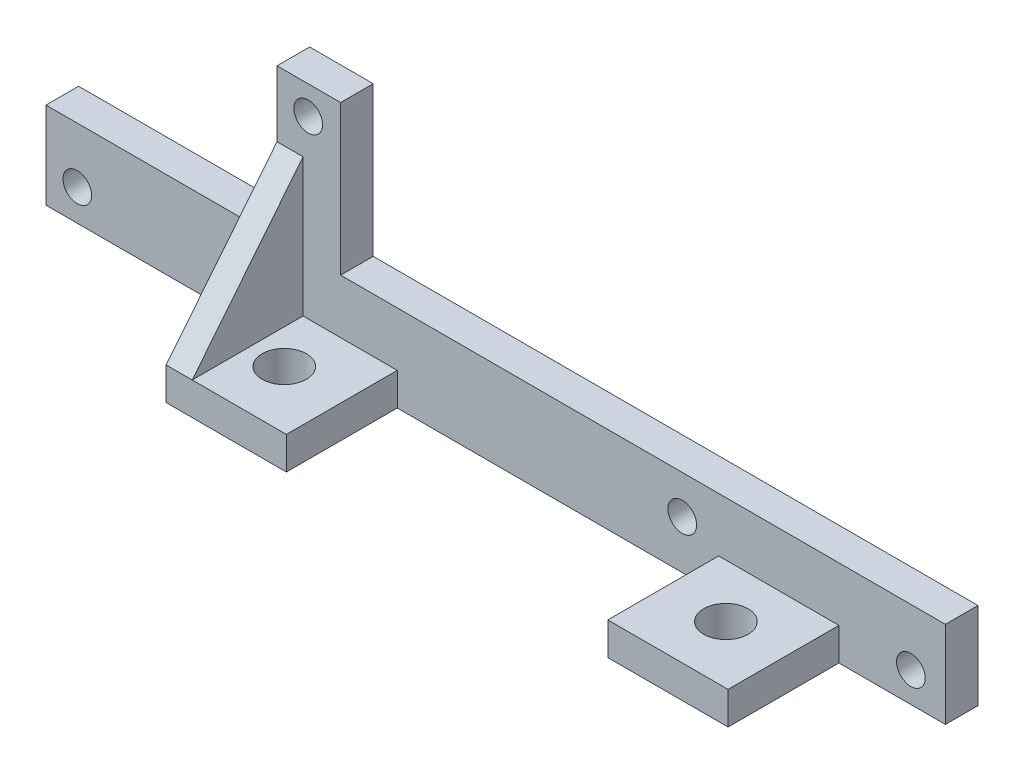
ISO-10303-21;
HEADER;
FILE_DESCRIPTION(('STEP AP214'),'2;1');
FILE_NAME('part.step','',(''),(''),'','','');
FILE_SCHEMA(('AUTOMOTIVE_DESIGN { 1 0 10303 214 1 1 1 1 }'));
ENDSEC;
DATA;
#1=APPLICATION_CONTEXT('core data for automotive mechanical design processes');
#2=APPLICATION_PROTOCOL_DEFINITION('international standard','automotive_design',2000,#1);
#3=PRODUCT_CONTEXT('',#1,'mechanical');
#4=PRODUCT('Part','Part','',(#3));
#5=PRODUCT_RELATED_PRODUCT_CATEGORY('part','',(#4));
#6=PRODUCT_DEFINITION_FORMATION('','',#4);
#7=PRODUCT_DEFINITION_CONTEXT('part definition',#1,'design');
#8=PRODUCT_DEFINITION('design','',#6,#7);
#9=PRODUCT_DEFINITION_SHAPE('','',#8);
#10=(LENGTH_UNIT() NAMED_UNIT(*) SI_UNIT(.MILLI.,.METRE.));
#11=(NAMED_UNIT(*) PLANE_ANGLE_UNIT() SI_UNIT($,.RADIAN.));
#12=(NAMED_UNIT(*) SI_UNIT($,.STERADIAN.) SOLID_ANGLE_UNIT());
#13=UNCERTAINTY_MEASURE_WITH_UNIT(LENGTH_MEASURE(1.E-05),#10,'distance_accuracy_value','');
#14=(GEOMETRIC_REPRESENTATION_CONTEXT(3) GLOBAL_UNCERTAINTY_ASSIGNED_CONTEXT((#13)) GLOBAL_UNIT_ASSIGNED_CONTEXT((#10,
#11,#12)) REPRESENTATION_CONTEXT('',''));
#15=CARTESIAN_POINT('',(0.,0.,0.));
#16=DIRECTION('',(0.,0.,1.));
#17=DIRECTION('',(1.,0.,0.));
#18=AXIS2_PLACEMENT_3D('',#15,#16,#17);
#19=CARTESIAN_POINT('',(0.,0.,0.));
#20=DIRECTION('',(0.,0.,-1.));
#21=DIRECTION('',(-1.,0.,0.));
#22=AXIS2_PLACEMENT_3D('',#19,#20,#21);
#23=PLANE('',#22);
#24=CARTESIAN_POINT('',(-39.952,-8.45200000000002,0.));
#25=DIRECTION('',(0.,0.,-1.));
#26=DIRECTION('',(-1.,0.,0.));
#27=AXIS2_PLACEMENT_3D('',#24,#25,#26);
#28=CIRCLE('',#27,1.397);
#29=CARTESIAN_POINT('',(-41.349,-8.45200000000002,0.));
#30=VERTEX_POINT('',#29);
#31=EDGE_CURVE('E227',#30,#30,#28,.T.);
#32=ORIENTED_EDGE('',*,*,#31,.T.);
#33=EDGE_LOOP('',(#32));
#34=FACE_BOUND('',#33,.T.);
#35=DIRECTION('',(0.,1.,0.));
#36=VECTOR('',#35,1.);
#37=CARTESIAN_POINT('',(-20.5101272468495,-39.3,0.));
#38=LINE('',#37,#36);
#39=CARTESIAN_POINT('',(-20.5101272468495,-11.5,0.));
#40=VERTEX_POINT('',#39);
#41=CARTESIAN_POINT('',(-20.5101272468495,-3.05620741999999,0.));
#42=VERTEX_POINT('',#41);
#43=EDGE_CURVE('E629',#40,#42,#38,.T.);
#44=ORIENTED_EDGE('',*,*,#43,.T.);
#45=DIRECTION('',(-1.,0.,0.));
#46=VECTOR('',#45,1.);
#47=CARTESIAN_POINT('',(-43.,-3.05620741999999,0.));
#48=LINE('',#47,#46);
#49=CARTESIAN_POINT('',(-43.,-3.05620741999999,0.));
#50=VERTEX_POINT('',#49);
#51=EDGE_CURVE('E186',#42,#50,#48,.T.);
#52=ORIENTED_EDGE('',*,*,#51,.T.);
#53=DIRECTION('',(0.,-1.,0.));
#54=VECTOR('',#53,1.);
#55=CARTESIAN_POINT('',(-43.,11.5,0.));
#56=LINE('',#55,#54);
#57=CARTESIAN_POINT('',(-43.,-11.5,0.));
#58=VERTEX_POINT('',#57);
#59=EDGE_CURVE('E296',#50,#58,#56,.T.);
#60=ORIENTED_EDGE('',*,*,#59,.T.);
#61=DIRECTION('',(1.,0.,0.));
#62=VECTOR('',#61,1.);
#63=CARTESIAN_POINT('',(-43.,-11.5,0.));
#64=LINE('',#63,#62);
#65=EDGE_CURVE('E301',#58,#40,#64,.T.);
#66=ORIENTED_EDGE('',*,*,#65,.T.);
#67=EDGE_LOOP('',(#44,#52,#60,#66));
#68=FACE_BOUND('',#67,.T.);
#69=ADVANCED_FACE('F39',(#34,#68),#23,.F.);
#70=CARTESIAN_POINT('',(0.,-8.325,0.));
#71=DIRECTION('',(0.,1.,0.));
#72=DIRECTION('',(0.,0.,1.));
#73=AXIS2_PLACEMENT_3D('',#70,#71,#72);
#74=PLANE('',#73);
#75=CARTESIAN_POINT('',(-14.6262602087204,-8.325,5.17743305211991));
#76=DIRECTION('',(0.,1.,0.));
#77=DIRECTION('',(0.,0.,1.));
#78=AXIS2_PLACEMENT_3D('',#75,#76,#77);
#79=CIRCLE('',#78,2.159);
#80=CARTESIAN_POINT('',(-14.6262602087204,-8.325,7.33643305211991));
#81=VERTEX_POINT('',#80);
#82=EDGE_CURVE('E251',#81,#81,#79,.T.);
#83=ORIENTED_EDGE('',*,*,#82,.F.);
#84=EDGE_LOOP('',(#83));
#85=FACE_BOUND('',#84,.T.);
#86=DIRECTION('',(1.,0.,0.));
#87=VECTOR('',#86,1.);
#88=CARTESIAN_POINT('',(-34.2000000105,-8.325,0.));
#89=LINE('',#88,#87);
#90=CARTESIAN_POINT('',(-17.9701272468495,-8.325,0.));
#91=VERTEX_POINT('',#90);
#92=CARTESIAN_POINT('',(-8.80000001050001,-8.325,0.));
#93=VERTEX_POINT('',#92);
#94=EDGE_CURVE('E275',#91,#93,#89,.T.);
#95=ORIENTED_EDGE('',*,*,#94,.F.);
#96=DIRECTION('',(0.,0.,1.));
#97=VECTOR('',#96,1.);
#98=CARTESIAN_POINT('',(-17.9701272468495,-8.325,0.));
#99=LINE('',#98,#97);
#100=CARTESIAN_POINT('',(-17.9701272468495,-8.325,10.795));
#101=VERTEX_POINT('',#100);
#102=EDGE_CURVE('E170',#91,#101,#99,.T.);
#103=ORIENTED_EDGE('',*,*,#102,.T.);
#104=DIRECTION('',(-1.,0.,0.));
#105=VECTOR('',#104,1.);
#106=CARTESIAN_POINT('',(-34.2000000105,-8.325,10.795));
#107=LINE('',#106,#105);
#108=CARTESIAN_POINT('',(-8.8000000105,-8.325,10.795));
#109=VERTEX_POINT('',#108);
#110=EDGE_CURVE('E281',#109,#101,#107,.T.);
#111=ORIENTED_EDGE('',*,*,#110,.F.);
#112=DIRECTION('',(0.,0.,1.));
#113=VECTOR('',#112,1.);
#114=CARTESIAN_POINT('',(-8.8000000105,-8.325,10.795));
#115=LINE('',#114,#113);
#116=EDGE_CURVE('E277',#93,#109,#115,.T.);
#117=ORIENTED_EDGE('',*,*,#116,.F.);
#118=EDGE_LOOP('',(#95,#103,#111,#117));
#119=FACE_BOUND('',#118,.T.);
#120=ADVANCED_FACE('F314',(#85,#119),#74,.T.);
#121=DIRECTION('',(0.,-1.,0.));
#122=VECTOR('',#121,1.);
#123=CARTESIAN_POINT('',(-20.5101272468495,11.5,0.));
#124=LINE('',#123,#122);
#125=CARTESIAN_POINT('',(-20.5101272468495,11.5,0.));
#126=VERTEX_POINT('',#125);
#127=CARTESIAN_POINT('',(-20.5101272468495,5.09978121447395,0.));
#128=VERTEX_POINT('',#127);
#129=EDGE_CURVE('E175',#126,#128,#124,.T.);
#130=ORIENTED_EDGE('',*,*,#129,.T.);
#131=DIRECTION('',(-1.,0.,0.));
#132=VECTOR('',#131,1.);
#133=CARTESIAN_POINT('',(0.,5.09978121447395,0.));
#134=LINE('',#133,#132);
#135=CARTESIAN_POINT('',(-17.9701272468495,5.09978121447395,0.));
#136=VERTEX_POINT('',#135);
#137=EDGE_CURVE('E160',#128,#136,#134,.F.);
#138=ORIENTED_EDGE('',*,*,#137,.T.);
#139=DIRECTION('',(0.,1.,0.));
#140=VECTOR('',#139,1.);
#141=CARTESIAN_POINT('',(-17.9701272468495,0.,0.));
#142=LINE('',#141,#140);
#143=EDGE_CURVE('E324',#91,#136,#142,.T.);
#144=ORIENTED_EDGE('',*,*,#143,.F.);
#145=ORIENTED_EDGE('',*,*,#94,.T.);
#146=DIRECTION('',(0.,-1.,0.));
#147=VECTOR('',#146,1.);
#148=CARTESIAN_POINT('',(-8.80000001050001,-8.325,0.));
#149=LINE('',#148,#147);
#150=CARTESIAN_POINT('',(-8.80000001050001,-11.5,0.));
#151=VERTEX_POINT('',#150);
#152=EDGE_CURVE('E284',#93,#151,#149,.T.);
#153=ORIENTED_EDGE('',*,*,#152,.T.);
#154=CARTESIAN_POINT('',(22.4898728085,-11.5,0.));
#155=VERTEX_POINT('',#154);
#156=EDGE_CURVE('E303',#151,#155,#64,.T.);
#157=ORIENTED_EDGE('',*,*,#156,.T.);
#158=DIRECTION('',(0.,1.,0.));
#159=VECTOR('',#158,1.);
#160=CARTESIAN_POINT('',(22.4898728085,-39.3,0.));
#161=LINE('',#160,#159);
#162=CARTESIAN_POINT('',(22.4898728085,-8.325,0.));
#163=VERTEX_POINT('',#162);
#164=EDGE_CURVE('E630',#155,#163,#161,.T.);
#165=ORIENTED_EDGE('',*,*,#164,.T.);
#166=DIRECTION('',(1.,0.,0.));
#167=VECTOR('',#166,1.);
#168=CARTESIAN_POINT('',(34.2000000105,-8.325,0.));
#169=LINE('',#168,#167);
#170=CARTESIAN_POINT('',(34.2000000105,-8.325,0.));
#171=VERTEX_POINT('',#170);
#172=EDGE_CURVE('E256',#163,#171,#169,.T.);
#173=ORIENTED_EDGE('',*,*,#172,.T.);
#174=DIRECTION('',(0.,-1.,0.));
#175=VECTOR('',#174,1.);
#176=CARTESIAN_POINT('',(34.2000000105,-8.325,0.));
#177=LINE('',#176,#175);
#178=CARTESIAN_POINT('',(34.2000000105,-11.5,0.));
#179=VERTEX_POINT('',#178);
#180=EDGE_CURVE('E265',#171,#179,#177,.T.);
#181=ORIENTED_EDGE('',*,*,#180,.T.);
#182=CARTESIAN_POINT('',(44.5635491781477,-11.5,0.));
#183=VERTEX_POINT('',#182);
#184=EDGE_CURVE('E290',#179,#183,#64,.T.);
#185=ORIENTED_EDGE('',*,*,#184,.T.);
#186=DIRECTION('',(0.,-1.,0.));
#187=VECTOR('',#186,1.);
#188=CARTESIAN_POINT('',(44.5635491781477,-11.5,0.));
#189=LINE('',#188,#187);
#190=CARTESIAN_POINT('',(44.5635491781477,-3.056207388,0.));
#191=VERTEX_POINT('',#190);
#192=EDGE_CURVE('E208',#191,#183,#189,.T.);
#193=ORIENTED_EDGE('',*,*,#192,.F.);
#194=DIRECTION('',(1.,0.,0.));
#195=VECTOR('',#194,1.);
#196=CARTESIAN_POINT('',(43.,-3.056207388,0.));
#197=LINE('',#196,#195);
#198=CARTESIAN_POINT('',(-14.3155277433446,-3.05620741999999,0.));
#199=VERTEX_POINT('',#198);
#200=EDGE_CURVE('E206',#199,#191,#197,.T.);
#201=ORIENTED_EDGE('',*,*,#200,.F.);
#202=DIRECTION('',(0.,1.,0.));
#203=VECTOR('',#202,1.);
#204=CARTESIAN_POINT('',(-14.3155277433446,11.5,0.));
#205=LINE('',#204,#203);
#206=CARTESIAN_POINT('',(-14.3155277433446,11.5,0.));
#207=VERTEX_POINT('',#206);
#208=EDGE_CURVE('E357',#199,#207,#205,.T.);
#209=ORIENTED_EDGE('',*,*,#208,.T.);
#210=DIRECTION('',(1.,0.,0.));
#211=VECTOR('',#210,1.);
#212=CARTESIAN_POINT('',(-43.,11.5,0.));
#213=LINE('',#212,#211);
#214=EDGE_CURVE('E185',#126,#207,#213,.T.);
#215=ORIENTED_EDGE('',*,*,#214,.F.);
#216=EDGE_LOOP('',(#130,#138,#144,#145,#153,#157,#165,#173,#181,#185,#193,#201,#209,#215));
#217=FACE_BOUND('',#216,.T.);
#218=CARTESIAN_POINT('',(41.206,-8.57899999999998,0.));
#219=DIRECTION('',(0.,0.,-1.));
#220=DIRECTION('',(-1.,0.,0.));
#221=AXIS2_PLACEMENT_3D('',#218,#219,#220);
#222=CIRCLE('',#221,1.397);
#223=CARTESIAN_POINT('',(39.809,-8.57899999999998,0.));
#224=VERTEX_POINT('',#223);
#225=EDGE_CURVE('E244',#224,#224,#222,.T.);
#226=ORIENTED_EDGE('',*,*,#225,.T.);
#227=EDGE_LOOP('',(#226));
#228=FACE_BOUND('',#227,.T.);
#229=CARTESIAN_POINT('',(-17.473,8.74379999999999,0.));
#230=DIRECTION('',(0.,0.,-1.));
#231=DIRECTION('',(-1.,0.,0.));
#232=AXIS2_PLACEMENT_3D('',#229,#230,#231);
#233=CIRCLE('',#232,1.397);
#234=CARTESIAN_POINT('',(-18.87,8.74379999999999,0.));
#235=VERTEX_POINT('',#234);
#236=EDGE_CURVE('E238',#235,#235,#233,.T.);
#237=ORIENTED_EDGE('',*,*,#236,.T.);
#238=EDGE_LOOP('',(#237));
#239=FACE_BOUND('',#238,.T.);
#240=CARTESIAN_POINT('',(18.9429,-6.80099999999999,0.));
#241=DIRECTION('',(0.,0.,-1.));
#242=DIRECTION('',(-1.,0.,0.));
#243=AXIS2_PLACEMENT_3D('',#240,#241,#242);
#244=CIRCLE('',#243,1.397);
#245=CARTESIAN_POINT('',(17.5459,-6.80099999999999,0.));
#246=VERTEX_POINT('',#245);
#247=EDGE_CURVE('E241',#246,#246,#244,.T.);
#248=ORIENTED_EDGE('',*,*,#247,.T.);
#249=EDGE_LOOP('',(#248));
#250=FACE_BOUND('',#249,.T.);
#251=ADVANCED_FACE('F181',(#217,#228,#239,#250),#23,.F.);
#252=CARTESIAN_POINT('',(-43.,-11.5,-3.175));
#253=DIRECTION('',(0.,-1.,0.));
#254=DIRECTION('',(0.,0.,-1.));
#255=AXIS2_PLACEMENT_3D('',#252,#253,#254);
#256=PLANE('',#255);
#257=DIRECTION('',(1.,0.,0.));
#258=VECTOR('',#257,1.);
#259=CARTESIAN_POINT('',(-43.,-11.5,-3.175));
#260=LINE('',#259,#258);
#261=CARTESIAN_POINT('',(-43.,-11.5,-3.175));
#262=VERTEX_POINT('',#261);
#263=CARTESIAN_POINT('',(44.5635491781477,-11.5,-3.175));
#264=VERTEX_POINT('',#263);
#265=EDGE_CURVE('E293',#262,#264,#260,.T.);
#266=ORIENTED_EDGE('',*,*,#265,.T.);
#267=DIRECTION('',(0.,0.,-1.));
#268=VECTOR('',#267,1.);
#269=CARTESIAN_POINT('',(44.5635491781477,-11.5,0.));
#270=LINE('',#269,#268);
#271=EDGE_CURVE('E219',#183,#264,#270,.T.);
#272=ORIENTED_EDGE('',*,*,#271,.F.);
#273=ORIENTED_EDGE('',*,*,#184,.F.);
#274=DIRECTION('',(0.,0.,1.));
#275=VECTOR('',#274,1.);
#276=CARTESIAN_POINT('',(34.2000000105,-11.5,0.));
#277=LINE('',#276,#275);
#278=CARTESIAN_POINT('',(34.2000000105,-11.5,10.795));
#279=VERTEX_POINT('',#278);
#280=EDGE_CURVE('E255',#179,#279,#277,.T.);
#281=ORIENTED_EDGE('',*,*,#280,.T.);
#282=DIRECTION('',(-1.,0.,0.));
#283=VECTOR('',#282,1.);
#284=CARTESIAN_POINT('',(34.2000000105,-11.5,10.795));
#285=LINE('',#284,#283);
#286=CARTESIAN_POINT('',(22.4898728085,-11.5,10.795));
#287=VERTEX_POINT('',#286);
#288=EDGE_CURVE('E259',#279,#287,#285,.T.);
#289=ORIENTED_EDGE('',*,*,#288,.T.);
#290=DIRECTION('',(0.,0.,1.));
#291=VECTOR('',#290,1.);
#292=CARTESIAN_POINT('',(22.4898728085,-11.5,-3.175));
#293=LINE('',#292,#291);
#294=EDGE_CURVE('E332',#155,#287,#293,.T.);
#295=ORIENTED_EDGE('',*,*,#294,.F.);
#296=ORIENTED_EDGE('',*,*,#156,.F.);
#297=DIRECTION('',(0.,0.,1.));
#298=VECTOR('',#297,1.);
#299=CARTESIAN_POINT('',(-8.8000000105,-11.5,10.795));
#300=LINE('',#299,#298);
#301=CARTESIAN_POINT('',(-8.8000000105,-11.5,10.795));
#302=VERTEX_POINT('',#301);
#303=EDGE_CURVE('E272',#151,#302,#300,.T.);
#304=ORIENTED_EDGE('',*,*,#303,.T.);
#305=DIRECTION('',(-1.,0.,0.));
#306=VECTOR('',#305,1.);
#307=CARTESIAN_POINT('',(-34.2000000105,-11.5,10.795));
#308=LINE('',#307,#306);
#309=CARTESIAN_POINT('',(-20.5101272468495,-11.5,10.795));
#310=VERTEX_POINT('',#309);
#311=EDGE_CURVE('E278',#302,#310,#308,.T.);
#312=ORIENTED_EDGE('',*,*,#311,.T.);
#313=DIRECTION('',(0.,0.,1.));
#314=VECTOR('',#313,1.);
#315=CARTESIAN_POINT('',(-20.5101272468495,-11.5,-3.175));
#316=LINE('',#315,#314);
#317=EDGE_CURVE('E196',#40,#310,#316,.T.);
#318=ORIENTED_EDGE('',*,*,#317,.F.);
#319=ORIENTED_EDGE('',*,*,#65,.F.);
#320=DIRECTION('',(0.,0.,1.));
#321=VECTOR('',#320,1.);
#322=CARTESIAN_POINT('',(-43.,-11.5,-3.175));
#323=LINE('',#322,#321);
#324=EDGE_CURVE('E47',#262,#58,#323,.T.);
#325=ORIENTED_EDGE('',*,*,#324,.F.);
#326=EDGE_LOOP('',(#266,#272,#273,#281,#289,#295,#296,#304,#312,#318,#319,#325));
#327=FACE_BOUND('',#326,.T.);
#328=CARTESIAN_POINT('',(-14.6262602087204,-11.5,5.17743305211991));
#329=DIRECTION('',(0.,-1.,0.));
#330=DIRECTION('',(0.,0.,-1.));
#331=AXIS2_PLACEMENT_3D('',#328,#329,#330);
#332=CIRCLE('',#331,2.159);
#333=CARTESIAN_POINT('',(-14.6262602087204,-11.5,3.01843305211991));
#334=VERTEX_POINT('',#333);
#335=EDGE_CURVE('E252',#334,#334,#332,.T.);
#336=ORIENTED_EDGE('',*,*,#335,.F.);
#337=EDGE_LOOP('',(#336));
#338=FACE_BOUND('',#337,.T.);
#339=CARTESIAN_POINT('',(28.3737398122796,-11.5,5.17743305211991));
#340=DIRECTION('',(0.,-1.,0.));
#341=DIRECTION('',(0.,0.,-1.));
#342=AXIS2_PLACEMENT_3D('',#339,#340,#341);
#343=CIRCLE('',#342,2.159);
#344=CARTESIAN_POINT('',(28.3737398122796,-11.5,3.01843305211991));
#345=VERTEX_POINT('',#344);
#346=EDGE_CURVE('E248',#345,#345,#343,.T.);
#347=ORIENTED_EDGE('',*,*,#346,.F.);
#348=EDGE_LOOP('',(#347));
#349=FACE_BOUND('',#348,.T.);
#350=ADVANCED_FACE('F41',(#327,#338,#349),#256,.T.);
#351=CARTESIAN_POINT('',(-43.,11.5,-3.175));
#352=DIRECTION('',(-1.,0.,0.));
#353=DIRECTION('',(0.,-1.,0.));
#354=AXIS2_PLACEMENT_3D('',#351,#352,#353);
#355=PLANE('',#354);
#356=DIRECTION('',(0.,0.,-1.));
#357=VECTOR('',#356,1.);
#358=CARTESIAN_POINT('',(-43.,-3.05620741999999,0.));
#359=LINE('',#358,#357);
#360=CARTESIAN_POINT('',(-43.,-3.05620741999999,-3.175));
#361=VERTEX_POINT('',#360);
#362=EDGE_CURVE('E198',#50,#361,#359,.T.);
#363=ORIENTED_EDGE('',*,*,#362,.T.);
#364=DIRECTION('',(0.,-1.,0.));
#365=VECTOR('',#364,1.);
#366=CARTESIAN_POINT('',(-43.,11.5,-3.175));
#367=LINE('',#366,#365);
#368=EDGE_CURVE('E299',#361,#262,#367,.T.);
#369=ORIENTED_EDGE('',*,*,#368,.T.);
#370=ORIENTED_EDGE('',*,*,#324,.T.);
#371=ORIENTED_EDGE('',*,*,#59,.F.);
#372=EDGE_LOOP('',(#363,#369,#370,#371));
#373=FACE_BOUND('',#372,.T.);
#374=ADVANCED_FACE('F366',(#373),#355,.T.);
#375=CARTESIAN_POINT('',(-43.,11.5,-3.175));
#376=DIRECTION('',(0.,-1.,0.));
#377=DIRECTION('',(0.,0.,-1.));
#378=AXIS2_PLACEMENT_3D('',#375,#376,#377);
#379=PLANE('',#378);
#380=ORIENTED_EDGE('',*,*,#214,.T.);
#381=DIRECTION('',(0.,0.,-1.));
#382=VECTOR('',#381,1.);
#383=CARTESIAN_POINT('',(-14.3155277433446,11.5,0.));
#384=LINE('',#383,#382);
#385=CARTESIAN_POINT('',(-14.3155277433446,11.5,-3.175));
#386=VERTEX_POINT('',#385);
#387=EDGE_CURVE('E216',#207,#386,#384,.T.);
#388=ORIENTED_EDGE('',*,*,#387,.T.);
#389=DIRECTION('',(1.,0.,0.));
#390=VECTOR('',#389,1.);
#391=CARTESIAN_POINT('',(-43.,11.5,-3.175));
#392=LINE('',#391,#390);
#393=CARTESIAN_POINT('',(-20.5101272468495,11.5,-3.175));
#394=VERTEX_POINT('',#393);
#395=EDGE_CURVE('E295',#394,#386,#392,.T.);
#396=ORIENTED_EDGE('',*,*,#395,.F.);
#397=DIRECTION('',(0.,0.,-1.));
#398=VECTOR('',#397,1.);
#399=CARTESIAN_POINT('',(-20.5101272468495,11.5,0.));
#400=LINE('',#399,#398);
#401=EDGE_CURVE('E61',#126,#394,#400,.T.);
#402=ORIENTED_EDGE('',*,*,#401,.F.);
#403=EDGE_LOOP('',(#380,#388,#396,#402));
#404=FACE_BOUND('',#403,.T.);
#405=ADVANCED_FACE('F364',(#404),#379,.F.);
#406=CARTESIAN_POINT('',(0.,0.,-3.175));
#407=DIRECTION('',(0.,0.,-1.));
#408=DIRECTION('',(-1.,0.,0.));
#409=AXIS2_PLACEMENT_3D('',#406,#407,#408);
#410=PLANE('',#409);
#411=CARTESIAN_POINT('',(-17.473,8.74379999999999,-3.175));
#412=DIRECTION('',(0.,0.,-1.));
#413=DIRECTION('',(1.,0.,0.));
#414=AXIS2_PLACEMENT_3D('',#411,#412,#413);
#415=CIRCLE('',#414,1.397);
#416=CARTESIAN_POINT('',(-16.076,8.74379999999999,-3.175));
#417=VERTEX_POINT('',#416);
#418=EDGE_CURVE('E231',#417,#417,#415,.T.);
#419=ORIENTED_EDGE('',*,*,#418,.F.);
#420=EDGE_LOOP('',(#419));
#421=FACE_BOUND('',#420,.T.);
#422=DIRECTION('',(-1.,0.,0.));
#423=VECTOR('',#422,1.);
#424=CARTESIAN_POINT('',(-43.,-3.05620741999999,-3.175));
#425=LINE('',#424,#423);
#426=CARTESIAN_POINT('',(-20.5101272468495,-3.05620741999999,-3.175));
#427=VERTEX_POINT('',#426);
#428=EDGE_CURVE('E187',#427,#361,#425,.T.);
#429=ORIENTED_EDGE('',*,*,#428,.F.);
#430=DIRECTION('',(0.,-1.,0.));
#431=VECTOR('',#430,1.);
#432=CARTESIAN_POINT('',(-20.5101272468495,11.5,-3.175));
#433=LINE('',#432,#431);
#434=EDGE_CURVE('E190',#394,#427,#433,.T.);
#435=ORIENTED_EDGE('',*,*,#434,.F.);
#436=ORIENTED_EDGE('',*,*,#395,.T.);
#437=DIRECTION('',(0.,1.,0.));
#438=VECTOR('',#437,1.);
#439=CARTESIAN_POINT('',(-14.3155277433446,11.5,-3.175));
#440=LINE('',#439,#438);
#441=CARTESIAN_POINT('',(-14.3155277433446,-3.05620741999999,-3.175));
#442=VERTEX_POINT('',#441);
#443=EDGE_CURVE('E201',#442,#386,#440,.T.);
#444=ORIENTED_EDGE('',*,*,#443,.F.);
#445=DIRECTION('',(1.,0.,0.));
#446=VECTOR('',#445,1.);
#447=CARTESIAN_POINT('',(43.,-3.056207388,-3.175));
#448=LINE('',#447,#446);
#449=CARTESIAN_POINT('',(44.5635491781477,-3.056207388,-3.175));
#450=VERTEX_POINT('',#449);
#451=EDGE_CURVE('E213',#442,#450,#448,.T.);
#452=ORIENTED_EDGE('',*,*,#451,.T.);
#453=DIRECTION('',(0.,-1.,0.));
#454=VECTOR('',#453,1.);
#455=CARTESIAN_POINT('',(44.5635491781477,-11.5,-3.175));
#456=LINE('',#455,#454);
#457=EDGE_CURVE('E209',#450,#264,#456,.T.);
#458=ORIENTED_EDGE('',*,*,#457,.T.);
#459=ORIENTED_EDGE('',*,*,#265,.F.);
#460=ORIENTED_EDGE('',*,*,#368,.F.);
#461=EDGE_LOOP('',(#429,#435,#436,#444,#452,#458,#459,#460));
#462=FACE_BOUND('',#461,.T.);
#463=CARTESIAN_POINT('',(-39.952,-8.45200000000002,-3.175));
#464=DIRECTION('',(0.,0.,-1.));
#465=DIRECTION('',(1.,0.,0.));
#466=AXIS2_PLACEMENT_3D('',#463,#464,#465);
#467=CIRCLE('',#466,1.397);
#468=CARTESIAN_POINT('',(-38.555,-8.45200000000002,-3.175));
#469=VERTEX_POINT('',#468);
#470=EDGE_CURVE('E222',#469,#469,#467,.T.);
#471=ORIENTED_EDGE('',*,*,#470,.F.);
#472=EDGE_LOOP('',(#471));
#473=FACE_BOUND('',#472,.T.);
#474=CARTESIAN_POINT('',(18.9429,-6.80099999999999,-3.175));
#475=DIRECTION('',(0.,0.,-1.));
#476=DIRECTION('',(1.,0.,0.));
#477=AXIS2_PLACEMENT_3D('',#474,#475,#476);
#478=CIRCLE('',#477,1.397);
#479=CARTESIAN_POINT('',(20.3399,-6.80099999999999,-3.175));
#480=VERTEX_POINT('',#479);
#481=EDGE_CURVE('E228',#480,#480,#478,.T.);
#482=ORIENTED_EDGE('',*,*,#481,.F.);
#483=EDGE_LOOP('',(#482));
#484=FACE_BOUND('',#483,.T.);
#485=CARTESIAN_POINT('',(41.206,-8.57899999999998,-3.175));
#486=DIRECTION('',(0.,0.,-1.));
#487=DIRECTION('',(1.,0.,0.));
#488=AXIS2_PLACEMENT_3D('',#485,#486,#487);
#489=CIRCLE('',#488,1.397);
#490=CARTESIAN_POINT('',(42.603,-8.57899999999998,-3.175));
#491=VERTEX_POINT('',#490);
#492=EDGE_CURVE('E224',#491,#491,#489,.T.);
#493=ORIENTED_EDGE('',*,*,#492,.F.);
#494=EDGE_LOOP('',(#493));
#495=FACE_BOUND('',#494,.T.);
#496=ADVANCED_FACE('F352',(#421,#462,#473,#484,#495),#410,.T.);
#497=CARTESIAN_POINT('',(-34.2000000105,-8.325,10.795));
#498=DIRECTION('',(0.,0.,1.));
#499=DIRECTION('',(1.,0.,0.));
#500=AXIS2_PLACEMENT_3D('',#497,#498,#499);
#501=PLANE('',#500);
#502=DIRECTION('',(0.,1.,0.));
#503=VECTOR('',#502,1.);
#504=CARTESIAN_POINT('',(-20.5101272468495,-39.3,10.795));
#505=LINE('',#504,#503);
#506=CARTESIAN_POINT('',(-20.5101272468495,-8.32500000000001,10.795));
#507=VERTEX_POINT('',#506);
#508=EDGE_CURVE('E178',#310,#507,#505,.T.);
#509=ORIENTED_EDGE('',*,*,#508,.F.);
#510=ORIENTED_EDGE('',*,*,#311,.F.);
#511=DIRECTION('',(0.,-1.,0.));
#512=VECTOR('',#511,1.);
#513=CARTESIAN_POINT('',(-8.8000000105,-8.325,10.795));
#514=LINE('',#513,#512);
#515=EDGE_CURVE('E288',#109,#302,#514,.T.);
#516=ORIENTED_EDGE('',*,*,#515,.F.);
#517=ORIENTED_EDGE('',*,*,#110,.T.);
#518=DIRECTION('',(-1.,0.,0.));
#519=VECTOR('',#518,1.);
#520=CARTESIAN_POINT('',(0.,-8.325,10.795));
#521=LINE('',#520,#519);
#522=EDGE_CURVE('E171',#507,#101,#521,.F.);
#523=ORIENTED_EDGE('',*,*,#522,.F.);
#524=EDGE_LOOP('',(#509,#510,#516,#517,#523));
#525=FACE_BOUND('',#524,.T.);
#526=ADVANCED_FACE('F371',(#525),#501,.T.);
#527=CARTESIAN_POINT('',(-8.8000000105,-8.325,10.795));
#528=DIRECTION('',(1.,0.,0.));
#529=DIRECTION('',(0.,0.,-1.));
#530=AXIS2_PLACEMENT_3D('',#527,#528,#529);
#531=PLANE('',#530);
#532=ORIENTED_EDGE('',*,*,#303,.F.);
#533=ORIENTED_EDGE('',*,*,#152,.F.);
#534=ORIENTED_EDGE('',*,*,#116,.T.);
#535=ORIENTED_EDGE('',*,*,#515,.T.);
#536=EDGE_LOOP('',(#532,#533,#534,#535));
#537=FACE_BOUND('',#536,.T.);
#538=ADVANCED_FACE('F326',(#537),#531,.T.);
#539=CARTESIAN_POINT('',(34.2000000105,-8.325,10.795));
#540=DIRECTION('',(0.,0.,1.));
#541=DIRECTION('',(1.,0.,0.));
#542=AXIS2_PLACEMENT_3D('',#539,#540,#541);
#543=PLANE('',#542);
#544=DIRECTION('',(0.,1.,0.));
#545=VECTOR('',#544,1.);
#546=CARTESIAN_POINT('',(22.4898728085,-39.3,10.795));
#547=LINE('',#546,#545);
#548=CARTESIAN_POINT('',(22.4898728085,-8.325,10.795));
#549=VERTEX_POINT('',#548);
#550=EDGE_CURVE('E54',#287,#549,#547,.T.);
#551=ORIENTED_EDGE('',*,*,#550,.F.);
#552=ORIENTED_EDGE('',*,*,#288,.F.);
#553=DIRECTION('',(0.,-1.,0.));
#554=VECTOR('',#553,1.);
#555=CARTESIAN_POINT('',(34.2000000105,-8.325,10.795));
#556=LINE('',#555,#554);
#557=CARTESIAN_POINT('',(34.2000000105,-8.325,10.795));
#558=VERTEX_POINT('',#557);
#559=EDGE_CURVE('E270',#558,#279,#556,.T.);
#560=ORIENTED_EDGE('',*,*,#559,.F.);
#561=DIRECTION('',(-1.,0.,0.));
#562=VECTOR('',#561,1.);
#563=CARTESIAN_POINT('',(34.2000000105,-8.325,10.795));
#564=LINE('',#563,#562);
#565=EDGE_CURVE('E262',#558,#549,#564,.T.);
#566=ORIENTED_EDGE('',*,*,#565,.T.);
#567=EDGE_LOOP('',(#551,#552,#560,#566));
#568=FACE_BOUND('',#567,.T.);
#569=ADVANCED_FACE('F422',(#568),#543,.T.);
#570=CARTESIAN_POINT('',(34.2000000105,-8.325,0.));
#571=DIRECTION('',(1.,0.,0.));
#572=DIRECTION('',(0.,0.,-1.));
#573=AXIS2_PLACEMENT_3D('',#570,#571,#572);
#574=PLANE('',#573);
#575=ORIENTED_EDGE('',*,*,#280,.F.);
#576=ORIENTED_EDGE('',*,*,#180,.F.);
#577=DIRECTION('',(0.,0.,1.));
#578=VECTOR('',#577,1.);
#579=CARTESIAN_POINT('',(34.2000000105,-8.325,0.));
#580=LINE('',#579,#578);
#581=EDGE_CURVE('E258',#171,#558,#580,.T.);
#582=ORIENTED_EDGE('',*,*,#581,.T.);
#583=ORIENTED_EDGE('',*,*,#559,.T.);
#584=EDGE_LOOP('',(#575,#576,#582,#583));
#585=FACE_BOUND('',#584,.T.);
#586=ADVANCED_FACE('F427',(#585),#574,.T.);
#587=CARTESIAN_POINT('',(0.,-8.325,0.));
#588=DIRECTION('',(0.,-1.,0.));
#589=DIRECTION('',(0.,0.,-1.));
#590=AXIS2_PLACEMENT_3D('',#587,#588,#589);
#591=PLANE('',#590);
#592=CARTESIAN_POINT('',(28.3737398122796,-8.325,5.17743305211991));
#593=DIRECTION('',(0.,-1.,0.));
#594=DIRECTION('',(0.,0.,-1.));
#595=AXIS2_PLACEMENT_3D('',#592,#593,#594);
#596=CIRCLE('',#595,2.159);
#597=CARTESIAN_POINT('',(28.3737398122796,-8.325,3.01843305211991));
#598=VERTEX_POINT('',#597);
#599=EDGE_CURVE('E247',#598,#598,#596,.T.);
#600=ORIENTED_EDGE('',*,*,#599,.T.);
#601=EDGE_LOOP('',(#600));
#602=FACE_BOUND('',#601,.T.);
#603=ORIENTED_EDGE('',*,*,#172,.F.);
#604=DIRECTION('',(0.,0.,1.));
#605=VECTOR('',#604,1.);
#606=CARTESIAN_POINT('',(22.4898728085,-8.325,0.));
#607=LINE('',#606,#605);
#608=EDGE_CURVE('E11',#163,#549,#607,.T.);
#609=ORIENTED_EDGE('',*,*,#608,.T.);
#610=ORIENTED_EDGE('',*,*,#565,.F.);
#611=ORIENTED_EDGE('',*,*,#581,.F.);
#612=EDGE_LOOP('',(#603,#609,#610,#611));
#613=FACE_BOUND('',#612,.T.);
#614=ADVANCED_FACE('F437',(#602,#613),#591,.F.);
#615=CARTESIAN_POINT('',(28.3737398122796,-115.5,5.17743305211991));
#616=DIRECTION('',(0.,1.,0.));
#617=DIRECTION('',(0.,0.,1.));
#618=AXIS2_PLACEMENT_3D('',#615,#616,#617);
#619=CYLINDRICAL_SURFACE('',#618,2.159);
#620=ORIENTED_EDGE('',*,*,#346,.T.);
#621=EDGE_LOOP('',(#620));
#622=FACE_BOUND('',#621,.T.);
#623=ORIENTED_EDGE('',*,*,#599,.F.);
#624=EDGE_LOOP('',(#623));
#625=FACE_BOUND('',#624,.T.);
#626=ADVANCED_FACE('F442',(#622,#625),#619,.F.);
#627=CARTESIAN_POINT('',(-14.6262602087204,-115.5,5.17743305211991));
#628=DIRECTION('',(0.,1.,0.));
#629=DIRECTION('',(0.,0.,1.));
#630=AXIS2_PLACEMENT_3D('',#627,#628,#629);
#631=CYLINDRICAL_SURFACE('',#630,2.159);
#632=ORIENTED_EDGE('',*,*,#335,.T.);
#633=EDGE_LOOP('',(#632));
#634=FACE_BOUND('',#633,.T.);
#635=ORIENTED_EDGE('',*,*,#82,.T.);
#636=EDGE_LOOP('',(#635));
#637=FACE_BOUND('',#636,.T.);
#638=ADVANCED_FACE('F312',(#634,#637),#631,.F.);
#639=CARTESIAN_POINT('',(-39.952,-8.45200000000002,10.795));
#640=DIRECTION('',(0.,0.,-1.));
#641=DIRECTION('',(-1.,0.,0.));
#642=AXIS2_PLACEMENT_3D('',#639,#640,#641);
#643=CYLINDRICAL_SURFACE('',#642,1.397);
#644=ORIENTED_EDGE('',*,*,#470,.T.);
#645=EDGE_LOOP('',(#644));
#646=FACE_BOUND('',#645,.T.);
#647=ORIENTED_EDGE('',*,*,#31,.F.);
#648=EDGE_LOOP('',(#647));
#649=FACE_BOUND('',#648,.T.);
#650=ADVANCED_FACE('F545',(#646,#649),#643,.F.);
#651=CARTESIAN_POINT('',(-17.473,8.74379999999999,10.795));
#652=DIRECTION('',(0.,0.,-1.));
#653=DIRECTION('',(-1.,0.,0.));
#654=AXIS2_PLACEMENT_3D('',#651,#652,#653);
#655=CYLINDRICAL_SURFACE('',#654,1.397);
#656=ORIENTED_EDGE('',*,*,#418,.T.);
#657=EDGE_LOOP('',(#656));
#658=FACE_BOUND('',#657,.T.);
#659=ORIENTED_EDGE('',*,*,#236,.F.);
#660=EDGE_LOOP('',(#659));
#661=FACE_BOUND('',#660,.T.);
#662=ADVANCED_FACE('F509',(#658,#661),#655,.F.);
#663=CARTESIAN_POINT('',(18.9429,-6.80099999999999,10.795));
#664=DIRECTION('',(0.,0.,-1.));
#665=DIRECTION('',(-1.,0.,0.));
#666=AXIS2_PLACEMENT_3D('',#663,#664,#665);
#667=CYLINDRICAL_SURFACE('',#666,1.397);
#668=ORIENTED_EDGE('',*,*,#481,.T.);
#669=EDGE_LOOP('',(#668));
#670=FACE_BOUND('',#669,.T.);
#671=ORIENTED_EDGE('',*,*,#247,.F.);
#672=EDGE_LOOP('',(#671));
#673=FACE_BOUND('',#672,.T.);
#674=ADVANCED_FACE('F539',(#670,#673),#667,.F.);
#675=CARTESIAN_POINT('',(41.206,-8.57899999999998,10.795));
#676=DIRECTION('',(0.,0.,-1.));
#677=DIRECTION('',(-1.,0.,0.));
#678=AXIS2_PLACEMENT_3D('',#675,#676,#677);
#679=CYLINDRICAL_SURFACE('',#678,1.397);
#680=ORIENTED_EDGE('',*,*,#492,.T.);
#681=EDGE_LOOP('',(#680));
#682=FACE_BOUND('',#681,.T.);
#683=ORIENTED_EDGE('',*,*,#225,.F.);
#684=EDGE_LOOP('',(#683));
#685=FACE_BOUND('',#684,.T.);
#686=ADVANCED_FACE('F535',(#682,#685),#679,.F.);
#687=CARTESIAN_POINT('',(44.5635491781477,-11.5,0.));
#688=DIRECTION('',(1.,0.,0.));
#689=DIRECTION('',(0.,1.,0.));
#690=AXIS2_PLACEMENT_3D('',#687,#688,#689);
#691=PLANE('',#690);
#692=ORIENTED_EDGE('',*,*,#457,.F.);
#693=DIRECTION('',(0.,0.,-1.));
#694=VECTOR('',#693,1.);
#695=CARTESIAN_POINT('',(44.5635491781477,-3.056207388,0.));
#696=LINE('',#695,#694);
#697=EDGE_CURVE('E212',#191,#450,#696,.T.);
#698=ORIENTED_EDGE('',*,*,#697,.F.);
#699=ORIENTED_EDGE('',*,*,#192,.T.);
#700=ORIENTED_EDGE('',*,*,#271,.T.);
#701=EDGE_LOOP('',(#692,#698,#699,#700));
#702=FACE_BOUND('',#701,.T.);
#703=ADVANCED_FACE('F344',(#702),#691,.T.);
#704=CARTESIAN_POINT('',(43.,-3.056207388,0.));
#705=DIRECTION('',(0.,1.,0.));
#706=DIRECTION('',(-1.,0.,0.));
#707=AXIS2_PLACEMENT_3D('',#704,#705,#706);
#708=PLANE('',#707);
#709=ORIENTED_EDGE('',*,*,#451,.F.);
#710=DIRECTION('',(0.,0.,-1.));
#711=VECTOR('',#710,1.);
#712=CARTESIAN_POINT('',(-14.3155277433446,-3.05620741999999,0.));
#713=LINE('',#712,#711);
#714=EDGE_CURVE('E193',#199,#442,#713,.T.);
#715=ORIENTED_EDGE('',*,*,#714,.F.);
#716=ORIENTED_EDGE('',*,*,#200,.T.);
#717=ORIENTED_EDGE('',*,*,#697,.T.);
#718=EDGE_LOOP('',(#709,#715,#716,#717));
#719=FACE_BOUND('',#718,.T.);
#720=ADVANCED_FACE('F346',(#719),#708,.T.);
#721=CARTESIAN_POINT('',(-14.3155277433446,11.5,0.));
#722=DIRECTION('',(-1.,0.,0.));
#723=DIRECTION('',(0.,0.,1.));
#724=AXIS2_PLACEMENT_3D('',#721,#722,#723);
#725=PLANE('',#724);
#726=ORIENTED_EDGE('',*,*,#443,.T.);
#727=ORIENTED_EDGE('',*,*,#387,.F.);
#728=ORIENTED_EDGE('',*,*,#208,.F.);
#729=ORIENTED_EDGE('',*,*,#714,.T.);
#730=EDGE_LOOP('',(#726,#727,#728,#729));
#731=FACE_BOUND('',#730,.T.);
#732=ADVANCED_FACE('F363',(#731),#725,.F.);
#733=CARTESIAN_POINT('',(-43.,-3.05620741999999,0.));
#734=DIRECTION('',(0.,-1.,0.));
#735=DIRECTION('',(1.,0.,0.));
#736=AXIS2_PLACEMENT_3D('',#733,#734,#735);
#737=PLANE('',#736);
#738=ORIENTED_EDGE('',*,*,#428,.T.);
#739=ORIENTED_EDGE('',*,*,#362,.F.);
#740=ORIENTED_EDGE('',*,*,#51,.F.);
#741=DIRECTION('',(0.,0.,-1.));
#742=VECTOR('',#741,1.);
#743=CARTESIAN_POINT('',(-20.5101272468495,-3.05620741999999,0.));
#744=LINE('',#743,#742);
#745=EDGE_CURVE('E202',#42,#427,#744,.T.);
#746=ORIENTED_EDGE('',*,*,#745,.T.);
#747=EDGE_LOOP('',(#738,#739,#740,#746));
#748=FACE_BOUND('',#747,.T.);
#749=ADVANCED_FACE('F413',(#748),#737,.F.);
#750=CARTESIAN_POINT('',(-20.5101272468495,11.5,0.));
#751=DIRECTION('',(1.,0.,0.));
#752=DIRECTION('',(0.,0.,-1.));
#753=AXIS2_PLACEMENT_3D('',#750,#751,#752);
#754=PLANE('',#753);
#755=ORIENTED_EDGE('',*,*,#434,.T.);
#756=ORIENTED_EDGE('',*,*,#745,.F.);
#757=ORIENTED_EDGE('',*,*,#43,.F.);
#758=ORIENTED_EDGE('',*,*,#317,.T.);
#759=ORIENTED_EDGE('',*,*,#508,.T.);
#760=DIRECTION('',(0.,-0.779303981039157,0.62664607645506));
#761=VECTOR('',#760,1.);
#762=CARTESIAN_POINT('',(-20.5101272468495,5.09978121447395,0.));
#763=LINE('',#762,#761);
#764=EDGE_CURVE('E163',#128,#507,#763,.T.);
#765=ORIENTED_EDGE('',*,*,#764,.F.);
#766=ORIENTED_EDGE('',*,*,#129,.F.);
#767=ORIENTED_EDGE('',*,*,#401,.T.);
#768=EDGE_LOOP('',(#755,#756,#757,#758,#759,#765,#766,#767));
#769=FACE_BOUND('',#768,.T.);
#770=ADVANCED_FACE('F174',(#769),#754,.F.);
#771=CARTESIAN_POINT('',(22.4898728085,-39.3,0.));
#772=DIRECTION('',(1.,0.,0.));
#773=DIRECTION('',(0.,0.,-1.));
#774=AXIS2_PLACEMENT_3D('',#771,#772,#773);
#775=PLANE('',#774);
#776=ORIENTED_EDGE('',*,*,#294,.T.);
#777=ORIENTED_EDGE('',*,*,#550,.T.);
#778=ORIENTED_EDGE('',*,*,#608,.F.);
#779=ORIENTED_EDGE('',*,*,#164,.F.);
#780=EDGE_LOOP('',(#776,#777,#778,#779));
#781=FACE_BOUND('',#780,.T.);
#782=ADVANCED_FACE('F457',(#781),#775,.F.);
#783=CARTESIAN_POINT('',(-17.9701272468495,0.,3.81));
#784=DIRECTION('',(-1.,0.,0.));
#785=DIRECTION('',(0.,0.,1.));
#786=AXIS2_PLACEMENT_3D('',#783,#784,#785);
#787=PLANE('',#786);
#788=ORIENTED_EDGE('',*,*,#102,.F.);
#789=ORIENTED_EDGE('',*,*,#143,.T.);
#790=DIRECTION('',(0.,-0.779303981039157,0.62664607645506));
#791=VECTOR('',#790,1.);
#792=CARTESIAN_POINT('',(-17.9701272468495,5.09978121447395,0.));
#793=LINE('',#792,#791);
#794=EDGE_CURVE('E166',#136,#101,#793,.T.);
#795=ORIENTED_EDGE('',*,*,#794,.T.);
#796=EDGE_LOOP('',(#788,#789,#795));
#797=FACE_BOUND('',#796,.T.);
#798=ADVANCED_FACE('F461',(#797),#787,.F.);
#799=CARTESIAN_POINT('',(-20.5101272468495,5.09978121447395,0.));
#800=DIRECTION('',(0.,-0.62664607645506,-0.779303981039157));
#801=DIRECTION('',(0.,-0.779303981039157,0.62664607645506));
#802=AXIS2_PLACEMENT_3D('',#799,#800,#801);
#803=PLANE('',#802);
#804=ORIENTED_EDGE('',*,*,#137,.F.);
#805=ORIENTED_EDGE('',*,*,#764,.T.);
#806=ORIENTED_EDGE('',*,*,#522,.T.);
#807=ORIENTED_EDGE('',*,*,#794,.F.);
#808=EDGE_LOOP('',(#804,#805,#806,#807));
#809=FACE_BOUND('',#808,.T.);
#810=ADVANCED_FACE('F162',(#809),#803,.F.);
#811=CLOSED_SHELL('',(#69,#120,#251,#350,#374,#405,#496,#526,#538,#569,#586,#614,#626,#638,#650,
#662,#674,#686,#703,#720,#732,#749,#770,#782,#798,#810));
#812=MANIFOLD_SOLID_BREP('B2',#811);
#813=ADVANCED_BREP_SHAPE_REPRESENTATION('',(#18,#812),#14);
#814=SHAPE_DEFINITION_REPRESENTATION(#9,#813);
ENDSEC;
END-ISO-10303-21;
